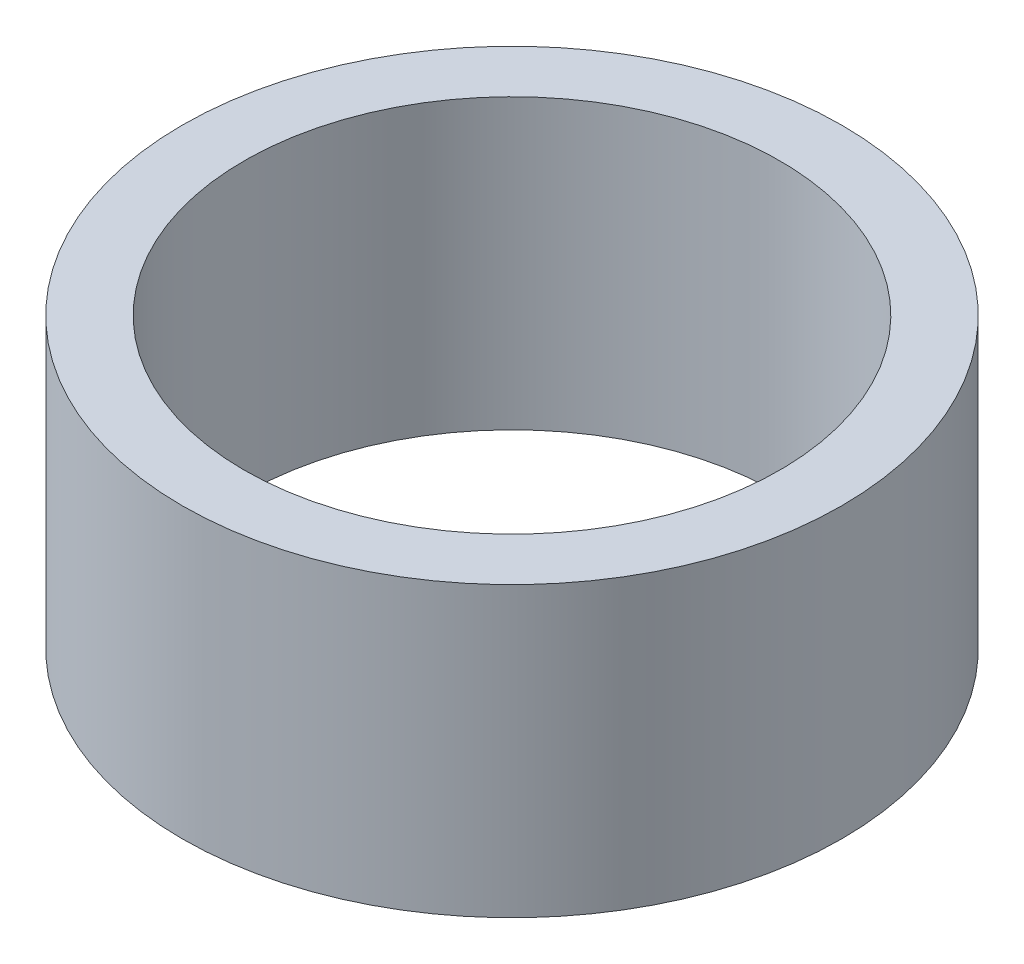
ISO-10303-21;
HEADER;
FILE_DESCRIPTION(('STEP AP214'),'2;1');
FILE_NAME('part.step','',(''),(''),'','','');
FILE_SCHEMA(('AUTOMOTIVE_DESIGN { 1 0 10303 214 1 1 1 1 }'));
ENDSEC;
DATA;
#1=APPLICATION_CONTEXT('core data for automotive mechanical design processes');
#2=APPLICATION_PROTOCOL_DEFINITION('international standard','automotive_design',2000,#1);
#3=PRODUCT_CONTEXT('',#1,'mechanical');
#4=PRODUCT('Part','Part','',(#3));
#5=PRODUCT_RELATED_PRODUCT_CATEGORY('part','',(#4));
#6=PRODUCT_DEFINITION_FORMATION('','',#4);
#7=PRODUCT_DEFINITION_CONTEXT('part definition',#1,'design');
#8=PRODUCT_DEFINITION('design','',#6,#7);
#9=PRODUCT_DEFINITION_SHAPE('','',#8);
#10=(LENGTH_UNIT() NAMED_UNIT(*) SI_UNIT(.MILLI.,.METRE.));
#11=(NAMED_UNIT(*) PLANE_ANGLE_UNIT() SI_UNIT($,.RADIAN.));
#12=(NAMED_UNIT(*) SI_UNIT($,.STERADIAN.) SOLID_ANGLE_UNIT());
#13=UNCERTAINTY_MEASURE_WITH_UNIT(LENGTH_MEASURE(1.E-05),#10,'distance_accuracy_value','');
#14=(GEOMETRIC_REPRESENTATION_CONTEXT(3) GLOBAL_UNCERTAINTY_ASSIGNED_CONTEXT((#13)) GLOBAL_UNIT_ASSIGNED_CONTEXT((#10,
#11,#12)) REPRESENTATION_CONTEXT('',''));
#15=CARTESIAN_POINT('',(0.,0.,0.));
#16=DIRECTION('',(0.,0.,1.));
#17=DIRECTION('',(1.,0.,0.));
#18=AXIS2_PLACEMENT_3D('',#15,#16,#17);
#19=CARTESIAN_POINT('',(0.,14.,0.));
#20=DIRECTION('',(0.,1.,0.));
#21=DIRECTION('',(0.,0.,1.));
#22=AXIS2_PLACEMENT_3D('',#19,#20,#21);
#23=PLANE('',#22);
#24=CARTESIAN_POINT('',(0.,14.,0.));
#25=DIRECTION('',(0.,1.,0.));
#26=DIRECTION('',(1.,0.,0.));
#27=AXIS2_PLACEMENT_3D('',#24,#25,#26);
#28=CIRCLE('',#27,16.);
#29=CARTESIAN_POINT('',(16.,14.,0.));
#30=VERTEX_POINT('',#29);
#31=EDGE_CURVE('E11',#30,#30,#28,.T.);
#32=ORIENTED_EDGE('',*,*,#31,.T.);
#33=EDGE_LOOP('',(#32));
#34=FACE_BOUND('',#33,.T.);
#35=CARTESIAN_POINT('',(0.,14.,0.));
#36=DIRECTION('',(0.,1.,0.));
#37=DIRECTION('',(0.,0.,1.));
#38=AXIS2_PLACEMENT_3D('',#35,#36,#37);
#39=CIRCLE('',#38,13.);
#40=CARTESIAN_POINT('',(0.,14.,13.));
#41=VERTEX_POINT('',#40);
#42=EDGE_CURVE('E53',#41,#41,#39,.T.);
#43=ORIENTED_EDGE('',*,*,#42,.F.);
#44=EDGE_LOOP('',(#43));
#45=FACE_BOUND('',#44,.T.);
#46=ADVANCED_FACE('F42',(#34,#45),#23,.T.);
#47=CARTESIAN_POINT('',(0.,0.,0.));
#48=DIRECTION('',(0.,1.,0.));
#49=DIRECTION('',(0.,0.,1.));
#50=AXIS2_PLACEMENT_3D('',#47,#48,#49);
#51=PLANE('',#50);
#52=CARTESIAN_POINT('',(0.,0.,0.));
#53=DIRECTION('',(0.,1.,0.));
#54=DIRECTION('',(1.,0.,0.));
#55=AXIS2_PLACEMENT_3D('',#52,#53,#54);
#56=CIRCLE('',#55,16.);
#57=CARTESIAN_POINT('',(16.,0.,0.));
#58=VERTEX_POINT('',#57);
#59=EDGE_CURVE('E46',#58,#58,#56,.T.);
#60=ORIENTED_EDGE('',*,*,#59,.F.);
#61=EDGE_LOOP('',(#60));
#62=FACE_BOUND('',#61,.T.);
#63=CARTESIAN_POINT('',(0.,0.,0.));
#64=DIRECTION('',(0.,1.,0.));
#65=DIRECTION('',(0.,0.,1.));
#66=AXIS2_PLACEMENT_3D('',#63,#64,#65);
#67=CIRCLE('',#66,13.);
#68=CARTESIAN_POINT('',(0.,0.,13.));
#69=VERTEX_POINT('',#68);
#70=EDGE_CURVE('E55',#69,#69,#67,.T.);
#71=ORIENTED_EDGE('',*,*,#70,.T.);
#72=EDGE_LOOP('',(#71));
#73=FACE_BOUND('',#72,.T.);
#74=ADVANCED_FACE('F65',(#62,#73),#51,.F.);
#75=CARTESIAN_POINT('',(0.,14.,0.));
#76=DIRECTION('',(0.,-1.,0.));
#77=DIRECTION('',(0.,0.,-1.));
#78=AXIS2_PLACEMENT_3D('',#75,#76,#77);
#79=CYLINDRICAL_SURFACE('',#78,16.);
#80=ORIENTED_EDGE('',*,*,#31,.F.);
#81=EDGE_LOOP('',(#80));
#82=FACE_BOUND('',#81,.T.);
#83=ORIENTED_EDGE('',*,*,#59,.T.);
#84=EDGE_LOOP('',(#83));
#85=FACE_BOUND('',#84,.T.);
#86=ADVANCED_FACE('F44',(#82,#85),#79,.T.);
#87=CARTESIAN_POINT('',(0.,14.,0.));
#88=DIRECTION('',(0.,-1.,0.));
#89=DIRECTION('',(0.,0.,-1.));
#90=AXIS2_PLACEMENT_3D('',#87,#88,#89);
#91=CYLINDRICAL_SURFACE('',#90,13.);
#92=ORIENTED_EDGE('',*,*,#42,.T.);
#93=EDGE_LOOP('',(#92));
#94=FACE_BOUND('',#93,.T.);
#95=ORIENTED_EDGE('',*,*,#70,.F.);
#96=EDGE_LOOP('',(#95));
#97=FACE_BOUND('',#96,.T.);
#98=ADVANCED_FACE('F61',(#94,#97),#91,.F.);
#99=CLOSED_SHELL('',(#46,#74,#86,#98));
#100=MANIFOLD_SOLID_BREP('B2',#99);
#101=ADVANCED_BREP_SHAPE_REPRESENTATION('',(#18,#100),#14);
#102=SHAPE_DEFINITION_REPRESENTATION(#9,#101);
ENDSEC;
END-ISO-10303-21;
